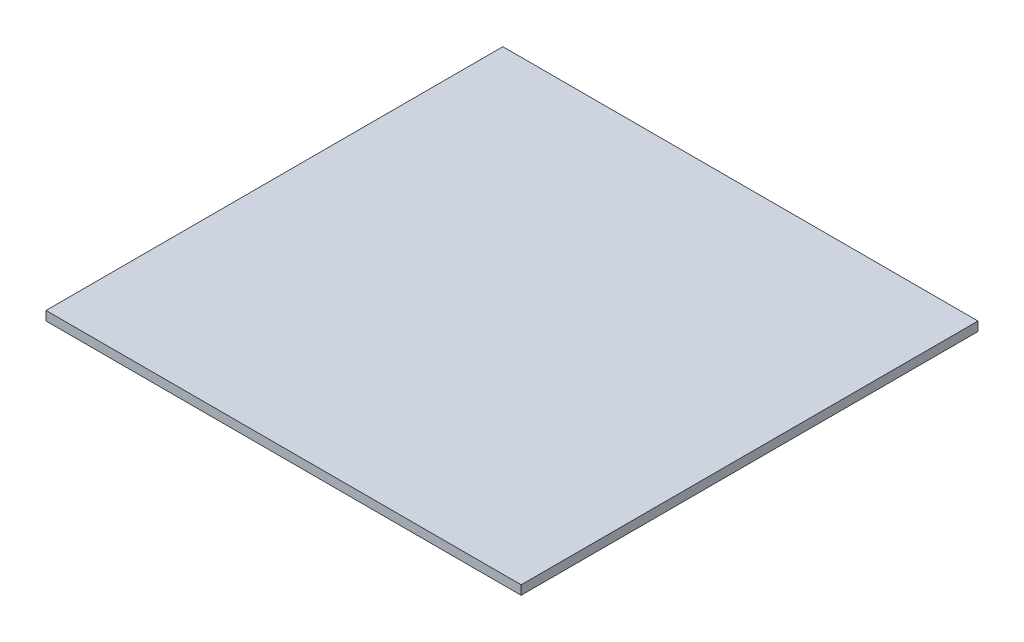
ISO-10303-21;
HEADER;
FILE_DESCRIPTION(('STEP AP214'),'2;1');
FILE_NAME('part.step','',(''),(''),'','','');
FILE_SCHEMA(('AUTOMOTIVE_DESIGN { 1 0 10303 214 1 1 1 1 }'));
ENDSEC;
DATA;
#1=APPLICATION_CONTEXT('core data for automotive mechanical design processes');
#2=APPLICATION_PROTOCOL_DEFINITION('international standard','automotive_design',2000,#1);
#3=PRODUCT_CONTEXT('',#1,'mechanical');
#4=PRODUCT('Part','Part','',(#3));
#5=PRODUCT_RELATED_PRODUCT_CATEGORY('part','',(#4));
#6=PRODUCT_DEFINITION_FORMATION('','',#4);
#7=PRODUCT_DEFINITION_CONTEXT('part definition',#1,'design');
#8=PRODUCT_DEFINITION('design','',#6,#7);
#9=PRODUCT_DEFINITION_SHAPE('','',#8);
#10=(LENGTH_UNIT() NAMED_UNIT(*) SI_UNIT(.MILLI.,.METRE.));
#11=(NAMED_UNIT(*) PLANE_ANGLE_UNIT() SI_UNIT($,.RADIAN.));
#12=(NAMED_UNIT(*) SI_UNIT($,.STERADIAN.) SOLID_ANGLE_UNIT());
#13=UNCERTAINTY_MEASURE_WITH_UNIT(LENGTH_MEASURE(1.E-05),#10,'distance_accuracy_value','');
#14=(GEOMETRIC_REPRESENTATION_CONTEXT(3) GLOBAL_UNCERTAINTY_ASSIGNED_CONTEXT((#13)) GLOBAL_UNIT_ASSIGNED_CONTEXT((#10,
#11,#12)) REPRESENTATION_CONTEXT('',''));
#15=CARTESIAN_POINT('',(0.,0.,0.));
#16=DIRECTION('',(0.,0.,1.));
#17=DIRECTION('',(1.,0.,0.));
#18=AXIS2_PLACEMENT_3D('',#15,#16,#17);
#19=CARTESIAN_POINT('',(0.,5.,0.));
#20=DIRECTION('',(1.,0.,0.));
#21=DIRECTION('',(0.,0.,-1.));
#22=AXIS2_PLACEMENT_3D('',#19,#20,#21);
#23=PLANE('',#22);
#24=DIRECTION('',(0.,0.,1.));
#25=VECTOR('',#24,1.);
#26=CARTESIAN_POINT('',(0.,0.,0.));
#27=LINE('',#26,#25);
#28=CARTESIAN_POINT('',(0.,0.,-250.));
#29=VERTEX_POINT('',#28);
#30=CARTESIAN_POINT('',(0.,0.,0.));
#31=VERTEX_POINT('',#30);
#32=EDGE_CURVE('E96',#29,#31,#27,.T.);
#33=ORIENTED_EDGE('',*,*,#32,.T.);
#34=DIRECTION('',(0.,-1.,0.));
#35=VECTOR('',#34,1.);
#36=CARTESIAN_POINT('',(0.,5.,0.));
#37=LINE('',#36,#35);
#38=CARTESIAN_POINT('',(0.,5.,0.));
#39=VERTEX_POINT('',#38);
#40=EDGE_CURVE('E11',#39,#31,#37,.T.);
#41=ORIENTED_EDGE('',*,*,#40,.F.);
#42=DIRECTION('',(0.,0.,1.));
#43=VECTOR('',#42,1.);
#44=CARTESIAN_POINT('',(0.,5.,0.));
#45=LINE('',#44,#43);
#46=CARTESIAN_POINT('',(0.,5.,-250.));
#47=VERTEX_POINT('',#46);
#48=EDGE_CURVE('E84',#47,#39,#45,.T.);
#49=ORIENTED_EDGE('',*,*,#48,.F.);
#50=DIRECTION('',(0.,-1.,0.));
#51=VECTOR('',#50,1.);
#52=CARTESIAN_POINT('',(0.,5.,-250.));
#53=LINE('',#52,#51);
#54=EDGE_CURVE('E92',#47,#29,#53,.T.);
#55=ORIENTED_EDGE('',*,*,#54,.T.);
#56=EDGE_LOOP('',(#33,#41,#49,#55));
#57=FACE_BOUND('',#56,.T.);
#58=ADVANCED_FACE('F33',(#57),#23,.F.);
#59=CARTESIAN_POINT('',(0.,5.,0.));
#60=DIRECTION('',(0.,0.,-1.));
#61=DIRECTION('',(-1.,0.,0.));
#62=AXIS2_PLACEMENT_3D('',#59,#60,#61);
#63=PLANE('',#62);
#64=DIRECTION('',(1.,0.,0.));
#65=VECTOR('',#64,1.);
#66=CARTESIAN_POINT('',(0.,0.,0.));
#67=LINE('',#66,#65);
#68=CARTESIAN_POINT('',(260.,0.,0.));
#69=VERTEX_POINT('',#68);
#70=EDGE_CURVE('E88',#31,#69,#67,.T.);
#71=ORIENTED_EDGE('',*,*,#70,.T.);
#72=DIRECTION('',(0.,-1.,0.));
#73=VECTOR('',#72,1.);
#74=CARTESIAN_POINT('',(260.,5.,0.));
#75=LINE('',#74,#73);
#76=CARTESIAN_POINT('',(260.,5.,0.));
#77=VERTEX_POINT('',#76);
#78=EDGE_CURVE('E41',#77,#69,#75,.T.);
#79=ORIENTED_EDGE('',*,*,#78,.F.);
#80=DIRECTION('',(1.,0.,0.));
#81=VECTOR('',#80,1.);
#82=CARTESIAN_POINT('',(0.,5.,0.));
#83=LINE('',#82,#81);
#84=EDGE_CURVE('E79',#39,#77,#83,.T.);
#85=ORIENTED_EDGE('',*,*,#84,.F.);
#86=ORIENTED_EDGE('',*,*,#40,.T.);
#87=EDGE_LOOP('',(#71,#79,#85,#86));
#88=FACE_BOUND('',#87,.T.);
#89=ADVANCED_FACE('F87',(#88),#63,.F.);
#90=CARTESIAN_POINT('',(260.,5.,0.));
#91=DIRECTION('',(-1.,0.,0.));
#92=DIRECTION('',(0.,0.,1.));
#93=AXIS2_PLACEMENT_3D('',#90,#91,#92);
#94=PLANE('',#93);
#95=DIRECTION('',(0.,0.,-1.));
#96=VECTOR('',#95,1.);
#97=CARTESIAN_POINT('',(260.,0.,0.));
#98=LINE('',#97,#96);
#99=CARTESIAN_POINT('',(260.,0.,-250.));
#100=VERTEX_POINT('',#99);
#101=EDGE_CURVE('E66',#69,#100,#98,.T.);
#102=ORIENTED_EDGE('',*,*,#101,.T.);
#103=DIRECTION('',(0.,-1.,0.));
#104=VECTOR('',#103,1.);
#105=CARTESIAN_POINT('',(260.,5.,-250.));
#106=LINE('',#105,#104);
#107=CARTESIAN_POINT('',(260.,5.,-250.));
#108=VERTEX_POINT('',#107);
#109=EDGE_CURVE('E89',#108,#100,#106,.T.);
#110=ORIENTED_EDGE('',*,*,#109,.F.);
#111=DIRECTION('',(0.,0.,-1.));
#112=VECTOR('',#111,1.);
#113=CARTESIAN_POINT('',(260.,5.,0.));
#114=LINE('',#113,#112);
#115=EDGE_CURVE('E82',#77,#108,#114,.T.);
#116=ORIENTED_EDGE('',*,*,#115,.F.);
#117=ORIENTED_EDGE('',*,*,#78,.T.);
#118=EDGE_LOOP('',(#102,#110,#116,#117));
#119=FACE_BOUND('',#118,.T.);
#120=ADVANCED_FACE('F90',(#119),#94,.F.);
#121=CARTESIAN_POINT('',(0.,5.,-250.));
#122=DIRECTION('',(0.,0.,1.));
#123=DIRECTION('',(1.,0.,0.));
#124=AXIS2_PLACEMENT_3D('',#121,#122,#123);
#125=PLANE('',#124);
#126=DIRECTION('',(-1.,0.,0.));
#127=VECTOR('',#126,1.);
#128=CARTESIAN_POINT('',(0.,0.,-250.));
#129=LINE('',#128,#127);
#130=EDGE_CURVE('E72',#100,#29,#129,.T.);
#131=ORIENTED_EDGE('',*,*,#130,.T.);
#132=ORIENTED_EDGE('',*,*,#54,.F.);
#133=DIRECTION('',(-1.,0.,0.));
#134=VECTOR('',#133,1.);
#135=CARTESIAN_POINT('',(0.,5.,-250.));
#136=LINE('',#135,#134);
#137=EDGE_CURVE('E49',#108,#47,#136,.T.);
#138=ORIENTED_EDGE('',*,*,#137,.F.);
#139=ORIENTED_EDGE('',*,*,#109,.T.);
#140=EDGE_LOOP('',(#131,#132,#138,#139));
#141=FACE_BOUND('',#140,.T.);
#142=ADVANCED_FACE('F103',(#141),#125,.F.);
#143=CARTESIAN_POINT('',(0.,5.,0.));
#144=DIRECTION('',(0.,-1.,0.));
#145=DIRECTION('',(0.,0.,-1.));
#146=AXIS2_PLACEMENT_3D('',#143,#144,#145);
#147=PLANE('',#146);
#148=ORIENTED_EDGE('',*,*,#48,.T.);
#149=ORIENTED_EDGE('',*,*,#84,.T.);
#150=ORIENTED_EDGE('',*,*,#115,.T.);
#151=ORIENTED_EDGE('',*,*,#137,.T.);
#152=EDGE_LOOP('',(#148,#149,#150,#151));
#153=FACE_BOUND('',#152,.T.);
#154=ADVANCED_FACE('F80',(#153),#147,.F.);
#155=CARTESIAN_POINT('',(0.,0.,0.));
#156=DIRECTION('',(0.,-1.,0.));
#157=DIRECTION('',(0.,0.,-1.));
#158=AXIS2_PLACEMENT_3D('',#155,#156,#157);
#159=PLANE('',#158);
#160=ORIENTED_EDGE('',*,*,#32,.F.);
#161=ORIENTED_EDGE('',*,*,#130,.F.);
#162=ORIENTED_EDGE('',*,*,#101,.F.);
#163=ORIENTED_EDGE('',*,*,#70,.F.);
#164=EDGE_LOOP('',(#160,#161,#162,#163));
#165=FACE_BOUND('',#164,.T.);
#166=ADVANCED_FACE('F106',(#165),#159,.T.);
#167=CLOSED_SHELL('',(#58,#89,#120,#142,#154,#166));
#168=MANIFOLD_SOLID_BREP('B2',#167);
#169=ADVANCED_BREP_SHAPE_REPRESENTATION('',(#18,#168),#14);
#170=SHAPE_DEFINITION_REPRESENTATION(#9,#169);
ENDSEC;
END-ISO-10303-21;
